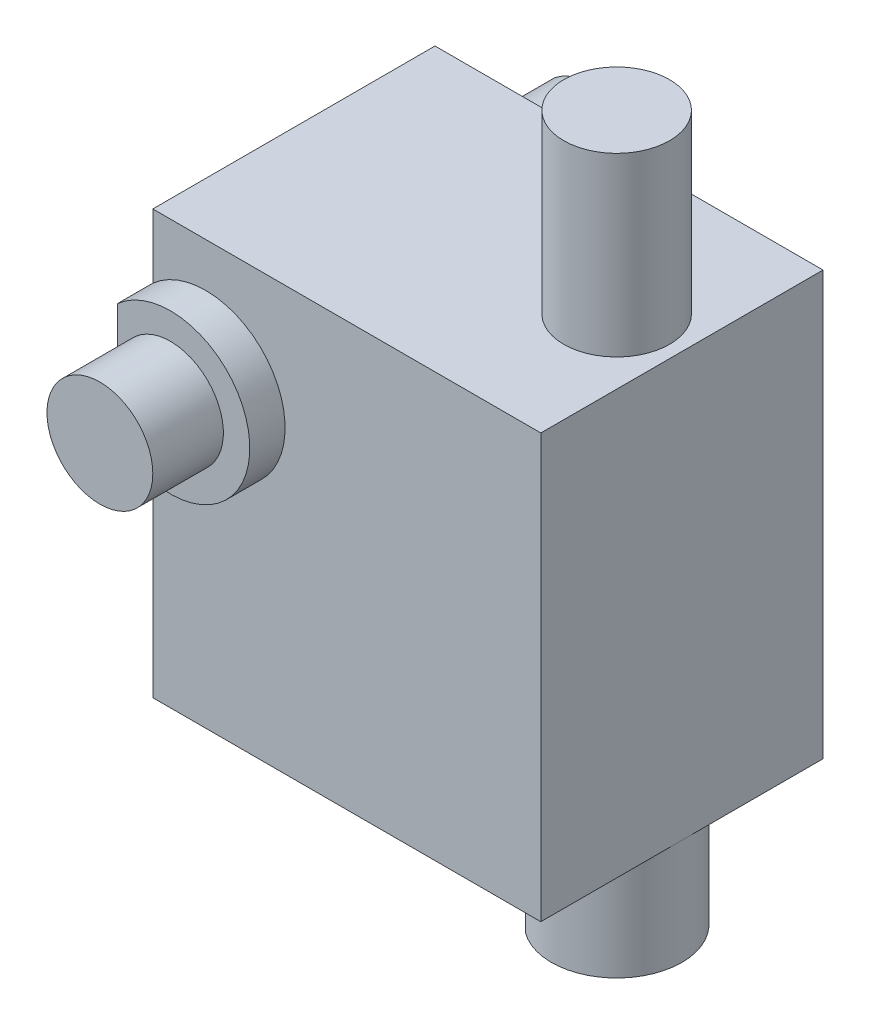
ISO-10303-21;
HEADER;
FILE_DESCRIPTION(('STEP AP214'),'2;1');
FILE_NAME('part.step','',(''),(''),'','','');
FILE_SCHEMA(('AUTOMOTIVE_DESIGN { 1 0 10303 214 1 1 1 1 }'));
ENDSEC;
DATA;
#1=APPLICATION_CONTEXT('core data for automotive mechanical design processes');
#2=APPLICATION_PROTOCOL_DEFINITION('international standard','automotive_design',2000,#1);
#3=PRODUCT_CONTEXT('',#1,'mechanical');
#4=PRODUCT('Part','Part','',(#3));
#5=PRODUCT_RELATED_PRODUCT_CATEGORY('part','',(#4));
#6=PRODUCT_DEFINITION_FORMATION('','',#4);
#7=PRODUCT_DEFINITION_CONTEXT('part definition',#1,'design');
#8=PRODUCT_DEFINITION('design','',#6,#7);
#9=PRODUCT_DEFINITION_SHAPE('','',#8);
#10=(LENGTH_UNIT() NAMED_UNIT(*) SI_UNIT(.MILLI.,.METRE.));
#11=(NAMED_UNIT(*) PLANE_ANGLE_UNIT() SI_UNIT($,.RADIAN.));
#12=(NAMED_UNIT(*) SI_UNIT($,.STERADIAN.) SOLID_ANGLE_UNIT());
#13=UNCERTAINTY_MEASURE_WITH_UNIT(LENGTH_MEASURE(1.E-05),#10,'distance_accuracy_value','');
#14=(GEOMETRIC_REPRESENTATION_CONTEXT(3) GLOBAL_UNCERTAINTY_ASSIGNED_CONTEXT((#13)) GLOBAL_UNIT_ASSIGNED_CONTEXT((#10,
#11,#12)) REPRESENTATION_CONTEXT('',''));
#15=CARTESIAN_POINT('',(0.,0.,0.));
#16=DIRECTION('',(0.,0.,1.));
#17=DIRECTION('',(1.,0.,0.));
#18=AXIS2_PLACEMENT_3D('',#15,#16,#17);
#19=CARTESIAN_POINT('',(-7.65,11.5,-5.));
#20=DIRECTION('',(0.,0.,1.));
#21=DIRECTION('',(1.,0.,0.));
#22=AXIS2_PLACEMENT_3D('',#19,#20,#21);
#23=PLANE('',#22);
#24=CARTESIAN_POINT('',(-7.65,11.5,-5.));
#25=DIRECTION('',(0.,0.,1.));
#26=DIRECTION('',(1.,0.,0.));
#27=AXIS2_PLACEMENT_3D('',#24,#25,#26);
#28=CIRCLE('',#27,2.25);
#29=CARTESIAN_POINT('',(-9.15,9.82294901687516,-5.));
#30=VERTEX_POINT('',#29);
#31=CARTESIAN_POINT('',(-9.15,13.1770509831248,-5.));
#32=VERTEX_POINT('',#31);
#33=EDGE_CURVE('E153',#30,#32,#28,.T.);
#34=ORIENTED_EDGE('',*,*,#33,.F.);
#35=DIRECTION('',(0.,-1.,0.));
#36=VECTOR('',#35,1.);
#37=CARTESIAN_POINT('',(-9.15,13.1770509831248,-5.));
#38=LINE('',#37,#36);
#39=EDGE_CURVE('E159',#32,#30,#38,.T.);
#40=ORIENTED_EDGE('',*,*,#39,.F.);
#41=EDGE_LOOP('',(#34,#40));
#42=FACE_BOUND('',#41,.T.);
#43=CARTESIAN_POINT('',(-7.65,11.5,-5.));
#44=DIRECTION('',(0.,0.,-1.));
#45=DIRECTION('',(-1.,0.,0.));
#46=AXIS2_PLACEMENT_3D('',#43,#44,#45);
#47=CIRCLE('',#46,1.8);
#48=CARTESIAN_POINT('',(-8.75,12.9247806848775,-5.));
#49=VERTEX_POINT('',#48);
#50=CARTESIAN_POINT('',(-8.75,10.0752193151225,-5.));
#51=VERTEX_POINT('',#50);
#52=EDGE_CURVE('E143',#49,#51,#47,.T.);
#53=ORIENTED_EDGE('',*,*,#52,.F.);
#54=DIRECTION('',(0.,1.,0.));
#55=VECTOR('',#54,1.);
#56=CARTESIAN_POINT('',(-8.75,10.0752193151225,-5.));
#57=LINE('',#56,#55);
#58=EDGE_CURVE('E46',#51,#49,#57,.T.);
#59=ORIENTED_EDGE('',*,*,#58,.F.);
#60=EDGE_LOOP('',(#53,#59));
#61=FACE_BOUND('',#60,.T.);
#62=ADVANCED_FACE('F32',(#42,#61),#23,.F.);
#63=CARTESIAN_POINT('',(1.85,15.,4.));
#64=DIRECTION('',(0.,0.,-1.));
#65=DIRECTION('',(-1.,0.,0.));
#66=AXIS2_PLACEMENT_3D('',#63,#64,#65);
#67=PLANE('',#66);
#68=CARTESIAN_POINT('',(-7.65,11.5,4.));
#69=DIRECTION('',(0.,0.,-1.));
#70=DIRECTION('',(-1.,0.,0.));
#71=AXIS2_PLACEMENT_3D('',#68,#69,#70);
#72=CIRCLE('',#71,2.25);
#73=CARTESIAN_POINT('',(-9.15,9.82294901687516,4.));
#74=VERTEX_POINT('',#73);
#75=CARTESIAN_POINT('',(-9.15,13.1770509831248,4.));
#76=VERTEX_POINT('',#75);
#77=EDGE_CURVE('E174',#74,#76,#72,.F.);
#78=ORIENTED_EDGE('',*,*,#77,.F.);
#79=DIRECTION('',(0.,-1.,0.));
#80=VECTOR('',#79,1.);
#81=CARTESIAN_POINT('',(-9.15,15.,4.));
#82=LINE('',#81,#80);
#83=CARTESIAN_POINT('',(-9.15,3.,4.));
#84=VERTEX_POINT('',#83);
#85=EDGE_CURVE('E213',#74,#84,#82,.T.);
#86=ORIENTED_EDGE('',*,*,#85,.T.);
#87=DIRECTION('',(1.,0.,0.));
#88=VECTOR('',#87,1.);
#89=CARTESIAN_POINT('',(1.85,3.,4.));
#90=LINE('',#89,#88);
#91=CARTESIAN_POINT('',(1.85,3.,4.));
#92=VERTEX_POINT('',#91);
#93=EDGE_CURVE('E196',#84,#92,#90,.T.);
#94=ORIENTED_EDGE('',*,*,#93,.T.);
#95=DIRECTION('',(0.,-1.,0.));
#96=VECTOR('',#95,1.);
#97=CARTESIAN_POINT('',(1.85,15.,4.));
#98=LINE('',#97,#96);
#99=CARTESIAN_POINT('',(1.85,15.,4.));
#100=VERTEX_POINT('',#99);
#101=EDGE_CURVE('E210',#100,#92,#98,.T.);
#102=ORIENTED_EDGE('',*,*,#101,.F.);
#103=DIRECTION('',(1.,0.,0.));
#104=VECTOR('',#103,1.);
#105=CARTESIAN_POINT('',(1.85,15.,4.));
#106=LINE('',#105,#104);
#107=CARTESIAN_POINT('',(-9.15,15.,4.));
#108=VERTEX_POINT('',#107);
#109=EDGE_CURVE('E186',#108,#100,#106,.T.);
#110=ORIENTED_EDGE('',*,*,#109,.F.);
#111=EDGE_CURVE('E54',#108,#76,#82,.T.);
#112=ORIENTED_EDGE('',*,*,#111,.T.);
#113=EDGE_LOOP('',(#78,#86,#94,#102,#110,#112));
#114=FACE_BOUND('',#113,.T.);
#115=ADVANCED_FACE('F251',(#114),#67,.F.);
#116=CARTESIAN_POINT('',(1.85,15.,-4.));
#117=DIRECTION('',(0.,0.,1.));
#118=DIRECTION('',(1.,0.,0.));
#119=AXIS2_PLACEMENT_3D('',#116,#117,#118);
#120=PLANE('',#119);
#121=CARTESIAN_POINT('',(-7.65,11.5,-4.));
#122=DIRECTION('',(0.,0.,1.));
#123=DIRECTION('',(1.,0.,0.));
#124=AXIS2_PLACEMENT_3D('',#121,#122,#123);
#125=CIRCLE('',#124,2.25);
#126=CARTESIAN_POINT('',(-9.15,13.1770509831248,-4.));
#127=VERTEX_POINT('',#126);
#128=CARTESIAN_POINT('',(-9.15,9.82294901687516,-4.));
#129=VERTEX_POINT('',#128);
#130=EDGE_CURVE('E11',#127,#129,#125,.F.);
#131=ORIENTED_EDGE('',*,*,#130,.F.);
#132=DIRECTION('',(0.,-1.,0.));
#133=VECTOR('',#132,1.);
#134=CARTESIAN_POINT('',(-9.15,15.,-4.));
#135=LINE('',#134,#133);
#136=CARTESIAN_POINT('',(-9.15,15.,-4.));
#137=VERTEX_POINT('',#136);
#138=EDGE_CURVE('E204',#137,#127,#135,.T.);
#139=ORIENTED_EDGE('',*,*,#138,.F.);
#140=DIRECTION('',(-1.,0.,0.));
#141=VECTOR('',#140,1.);
#142=CARTESIAN_POINT('',(1.85,15.,-4.));
#143=LINE('',#142,#141);
#144=CARTESIAN_POINT('',(1.85,15.,-4.));
#145=VERTEX_POINT('',#144);
#146=EDGE_CURVE('E191',#145,#137,#143,.T.);
#147=ORIENTED_EDGE('',*,*,#146,.F.);
#148=DIRECTION('',(0.,-1.,0.));
#149=VECTOR('',#148,1.);
#150=CARTESIAN_POINT('',(1.85,15.,-4.));
#151=LINE('',#150,#149);
#152=CARTESIAN_POINT('',(1.85,3.,-4.));
#153=VERTEX_POINT('',#152);
#154=EDGE_CURVE('E207',#145,#153,#151,.T.);
#155=ORIENTED_EDGE('',*,*,#154,.T.);
#156=DIRECTION('',(-1.,0.,0.));
#157=VECTOR('',#156,1.);
#158=CARTESIAN_POINT('',(1.85,3.,-4.));
#159=LINE('',#158,#157);
#160=CARTESIAN_POINT('',(-9.15,3.,-4.));
#161=VERTEX_POINT('',#160);
#162=EDGE_CURVE('E187',#153,#161,#159,.T.);
#163=ORIENTED_EDGE('',*,*,#162,.T.);
#164=EDGE_CURVE('E193',#129,#161,#135,.T.);
#165=ORIENTED_EDGE('',*,*,#164,.F.);
#166=EDGE_LOOP('',(#131,#139,#147,#155,#163,#165));
#167=FACE_BOUND('',#166,.T.);
#168=ADVANCED_FACE('F257',(#167),#120,.F.);
#169=CARTESIAN_POINT('',(0.,3.,0.));
#170=DIRECTION('',(0.,-1.,0.));
#171=DIRECTION('',(0.,0.,-1.));
#172=AXIS2_PLACEMENT_3D('',#169,#170,#171);
#173=CYLINDRICAL_SURFACE('',#172,1.85);
#174=CARTESIAN_POINT('',(0.,0.,0.));
#175=DIRECTION('',(0.,1.,0.));
#176=DIRECTION('',(0.,0.,1.));
#177=AXIS2_PLACEMENT_3D('',#174,#175,#176);
#178=CIRCLE('',#177,1.85);
#179=CARTESIAN_POINT('',(-1.1,0.,1.48744747806435));
#180=VERTEX_POINT('',#179);
#181=CARTESIAN_POINT('',(-1.1,0.,-1.48744747806435));
#182=VERTEX_POINT('',#181);
#183=EDGE_CURVE('E215',#180,#182,#178,.T.);
#184=ORIENTED_EDGE('',*,*,#183,.T.);
#185=DIRECTION('',(0.,-1.,0.));
#186=VECTOR('',#185,1.);
#187=CARTESIAN_POINT('',(-1.1,3.,-1.48744747806435));
#188=LINE('',#187,#186);
#189=CARTESIAN_POINT('',(-1.1,3.,-1.48744747806435));
#190=VERTEX_POINT('',#189);
#191=EDGE_CURVE('E40',#190,#182,#188,.T.);
#192=ORIENTED_EDGE('',*,*,#191,.F.);
#193=CARTESIAN_POINT('',(0.,3.,0.));
#194=DIRECTION('',(0.,1.,0.));
#195=DIRECTION('',(0.,0.,1.));
#196=AXIS2_PLACEMENT_3D('',#193,#194,#195);
#197=CIRCLE('',#196,1.85);
#198=CARTESIAN_POINT('',(1.85,3.,0.));
#199=VERTEX_POINT('',#198);
#200=EDGE_CURVE('E220',#199,#190,#197,.T.);
#201=ORIENTED_EDGE('',*,*,#200,.F.);
#202=CARTESIAN_POINT('',(-1.1,3.,1.48744747806435));
#203=VERTEX_POINT('',#202);
#204=EDGE_CURVE('E216',#203,#199,#197,.T.);
#205=ORIENTED_EDGE('',*,*,#204,.F.);
#206=DIRECTION('',(0.,-1.,0.));
#207=VECTOR('',#206,1.);
#208=CARTESIAN_POINT('',(-1.1,3.,1.48744747806435));
#209=LINE('',#208,#207);
#210=EDGE_CURVE('E223',#203,#180,#209,.T.);
#211=ORIENTED_EDGE('',*,*,#210,.T.);
#212=EDGE_LOOP('',(#184,#192,#201,#205,#211));
#213=FACE_BOUND('',#212,.T.);
#214=ADVANCED_FACE('F34',(#213),#173,.T.);
#215=CARTESIAN_POINT('',(-1.1,3.,-1.48744747806435));
#216=DIRECTION('',(1.,0.,0.));
#217=DIRECTION('',(0.,0.,-1.));
#218=AXIS2_PLACEMENT_3D('',#215,#216,#217);
#219=PLANE('',#218);
#220=DIRECTION('',(0.,0.,1.));
#221=VECTOR('',#220,1.);
#222=CARTESIAN_POINT('',(-1.1,0.,-1.48744747806435));
#223=LINE('',#222,#221);
#224=EDGE_CURVE('E226',#182,#180,#223,.T.);
#225=ORIENTED_EDGE('',*,*,#224,.T.);
#226=ORIENTED_EDGE('',*,*,#210,.F.);
#227=DIRECTION('',(0.,0.,1.));
#228=VECTOR('',#227,1.);
#229=CARTESIAN_POINT('',(-1.1,3.,-1.48744747806435));
#230=LINE('',#229,#228);
#231=EDGE_CURVE('E219',#190,#203,#230,.T.);
#232=ORIENTED_EDGE('',*,*,#231,.F.);
#233=ORIENTED_EDGE('',*,*,#191,.T.);
#234=EDGE_LOOP('',(#225,#226,#232,#233));
#235=FACE_BOUND('',#234,.T.);
#236=ADVANCED_FACE('F232',(#235),#219,.F.);
#237=CARTESIAN_POINT('',(0.,0.,0.));
#238=DIRECTION('',(0.,1.,0.));
#239=DIRECTION('',(0.,0.,1.));
#240=AXIS2_PLACEMENT_3D('',#237,#238,#239);
#241=PLANE('',#240);
#242=ORIENTED_EDGE('',*,*,#183,.F.);
#243=ORIENTED_EDGE('',*,*,#224,.F.);
#244=EDGE_LOOP('',(#242,#243));
#245=FACE_BOUND('',#244,.T.);
#246=ADVANCED_FACE('F238',(#245),#241,.F.);
#247=CARTESIAN_POINT('',(0.,3.,0.));
#248=DIRECTION('',(0.,1.,0.));
#249=DIRECTION('',(0.,0.,1.));
#250=AXIS2_PLACEMENT_3D('',#247,#248,#249);
#251=PLANE('',#250);
#252=ORIENTED_EDGE('',*,*,#231,.T.);
#253=ORIENTED_EDGE('',*,*,#204,.T.);
#254=DIRECTION('',(0.,0.,-1.));
#255=VECTOR('',#254,1.);
#256=CARTESIAN_POINT('',(1.85,3.,4.));
#257=LINE('',#256,#255);
#258=EDGE_CURVE('E199',#92,#199,#257,.T.);
#259=ORIENTED_EDGE('',*,*,#258,.F.);
#260=ORIENTED_EDGE('',*,*,#93,.F.);
#261=DIRECTION('',(0.,0.,1.));
#262=VECTOR('',#261,1.);
#263=CARTESIAN_POINT('',(-9.15,3.,4.));
#264=LINE('',#263,#262);
#265=EDGE_CURVE('E180',#161,#84,#264,.T.);
#266=ORIENTED_EDGE('',*,*,#265,.F.);
#267=ORIENTED_EDGE('',*,*,#162,.F.);
#268=EDGE_CURVE('E198',#199,#153,#257,.T.);
#269=ORIENTED_EDGE('',*,*,#268,.F.);
#270=ORIENTED_EDGE('',*,*,#200,.T.);
#271=EDGE_LOOP('',(#252,#253,#259,#260,#266,#267,#269,#270));
#272=FACE_BOUND('',#271,.T.);
#273=ADVANCED_FACE('F240',(#272),#251,.F.);
#274=CARTESIAN_POINT('',(-9.15,15.,4.));
#275=DIRECTION('',(1.,0.,0.));
#276=DIRECTION('',(0.,0.,-1.));
#277=AXIS2_PLACEMENT_3D('',#274,#275,#276);
#278=PLANE('',#277);
#279=DIRECTION('',(0.,0.,-1.));
#280=VECTOR('',#279,1.);
#281=CARTESIAN_POINT('',(-9.15,13.1770509831248,5.));
#282=LINE('',#281,#280);
#283=CARTESIAN_POINT('',(-9.15,13.1770509831248,5.));
#284=VERTEX_POINT('',#283);
#285=EDGE_CURVE('E171',#284,#76,#282,.T.);
#286=ORIENTED_EDGE('',*,*,#285,.T.);
#287=ORIENTED_EDGE('',*,*,#111,.F.);
#288=DIRECTION('',(0.,0.,1.));
#289=VECTOR('',#288,1.);
#290=CARTESIAN_POINT('',(-9.15,15.,4.));
#291=LINE('',#290,#289);
#292=EDGE_CURVE('E183',#137,#108,#291,.T.);
#293=ORIENTED_EDGE('',*,*,#292,.F.);
#294=ORIENTED_EDGE('',*,*,#138,.T.);
#295=EDGE_CURVE('E170',#127,#32,#282,.T.);
#296=ORIENTED_EDGE('',*,*,#295,.T.);
#297=ORIENTED_EDGE('',*,*,#39,.T.);
#298=DIRECTION('',(0.,0.,-1.));
#299=VECTOR('',#298,1.);
#300=CARTESIAN_POINT('',(-9.15,9.82294901687516,5.));
#301=LINE('',#300,#299);
#302=EDGE_CURVE('E162',#129,#30,#301,.T.);
#303=ORIENTED_EDGE('',*,*,#302,.F.);
#304=ORIENTED_EDGE('',*,*,#164,.T.);
#305=ORIENTED_EDGE('',*,*,#265,.T.);
#306=ORIENTED_EDGE('',*,*,#85,.F.);
#307=CARTESIAN_POINT('',(-9.15,9.82294901687516,5.));
#308=VERTEX_POINT('',#307);
#309=EDGE_CURVE('E167',#308,#74,#301,.T.);
#310=ORIENTED_EDGE('',*,*,#309,.F.);
#311=DIRECTION('',(0.,-1.,0.));
#312=VECTOR('',#311,1.);
#313=CARTESIAN_POINT('',(-9.15,13.1770509831248,5.));
#314=LINE('',#313,#312);
#315=CARTESIAN_POINT('',(-9.15,11.5,5.));
#316=VERTEX_POINT('',#315);
#317=EDGE_CURVE('E158',#316,#308,#314,.T.);
#318=ORIENTED_EDGE('',*,*,#317,.F.);
#319=EDGE_CURVE('E160',#284,#316,#314,.T.);
#320=ORIENTED_EDGE('',*,*,#319,.F.);
#321=EDGE_LOOP('',(#286,#287,#293,#294,#296,#297,#303,#304,#305,#306,#310,#318,#320));
#322=FACE_BOUND('',#321,.T.);
#323=ADVANCED_FACE('F246',(#322),#278,.F.);
#324=CARTESIAN_POINT('',(1.85,15.,4.));
#325=DIRECTION('',(-1.,0.,0.));
#326=DIRECTION('',(0.,0.,1.));
#327=AXIS2_PLACEMENT_3D('',#324,#325,#326);
#328=PLANE('',#327);
#329=ORIENTED_EDGE('',*,*,#258,.T.);
#330=ORIENTED_EDGE('',*,*,#268,.T.);
#331=ORIENTED_EDGE('',*,*,#154,.F.);
#332=DIRECTION('',(0.,0.,-1.));
#333=VECTOR('',#332,1.);
#334=CARTESIAN_POINT('',(1.85,15.,4.));
#335=LINE('',#334,#333);
#336=EDGE_CURVE('E189',#100,#145,#335,.T.);
#337=ORIENTED_EDGE('',*,*,#336,.F.);
#338=ORIENTED_EDGE('',*,*,#101,.T.);
#339=EDGE_LOOP('',(#329,#330,#331,#337,#338));
#340=FACE_BOUND('',#339,.T.);
#341=ADVANCED_FACE('F279',(#340),#328,.F.);
#342=CARTESIAN_POINT('',(0.,15.,0.));
#343=DIRECTION('',(0.,1.,0.));
#344=DIRECTION('',(0.,0.,1.));
#345=AXIS2_PLACEMENT_3D('',#342,#343,#344);
#346=PLANE('',#345);
#347=CARTESIAN_POINT('',(0.,15.,0.));
#348=DIRECTION('',(0.,1.,0.));
#349=DIRECTION('',(0.,0.,1.));
#350=AXIS2_PLACEMENT_3D('',#347,#348,#349);
#351=CIRCLE('',#350,1.5);
#352=CARTESIAN_POINT('',(0.,15.,1.5));
#353=VERTEX_POINT('',#352);
#354=EDGE_CURVE('E176',#353,#353,#351,.T.);
#355=ORIENTED_EDGE('',*,*,#354,.F.);
#356=EDGE_LOOP('',(#355));
#357=FACE_BOUND('',#356,.T.);
#358=ORIENTED_EDGE('',*,*,#292,.T.);
#359=ORIENTED_EDGE('',*,*,#109,.T.);
#360=ORIENTED_EDGE('',*,*,#336,.T.);
#361=ORIENTED_EDGE('',*,*,#146,.T.);
#362=EDGE_LOOP('',(#358,#359,#360,#361));
#363=FACE_BOUND('',#362,.T.);
#364=ADVANCED_FACE('F276',(#357,#363),#346,.T.);
#365=CARTESIAN_POINT('',(0.,20.,0.));
#366=DIRECTION('',(0.,-1.,0.));
#367=DIRECTION('',(0.,0.,-1.));
#368=AXIS2_PLACEMENT_3D('',#365,#366,#367);
#369=CYLINDRICAL_SURFACE('',#368,1.5);
#370=CARTESIAN_POINT('',(0.,20.,0.));
#371=DIRECTION('',(0.,1.,0.));
#372=DIRECTION('',(0.,0.,1.));
#373=AXIS2_PLACEMENT_3D('',#370,#371,#372);
#374=CIRCLE('',#373,1.5);
#375=CARTESIAN_POINT('',(0.,20.,1.5));
#376=VERTEX_POINT('',#375);
#377=EDGE_CURVE('E177',#376,#376,#374,.T.);
#378=ORIENTED_EDGE('',*,*,#377,.F.);
#379=EDGE_LOOP('',(#378));
#380=FACE_BOUND('',#379,.T.);
#381=ORIENTED_EDGE('',*,*,#354,.T.);
#382=EDGE_LOOP('',(#381));
#383=FACE_BOUND('',#382,.T.);
#384=ADVANCED_FACE('F272',(#380,#383),#369,.T.);
#385=CARTESIAN_POINT('',(0.,20.,0.));
#386=DIRECTION('',(0.,1.,0.));
#387=DIRECTION('',(0.,0.,1.));
#388=AXIS2_PLACEMENT_3D('',#385,#386,#387);
#389=PLANE('',#388);
#390=ORIENTED_EDGE('',*,*,#377,.T.);
#391=EDGE_LOOP('',(#390));
#392=FACE_BOUND('',#391,.T.);
#393=ADVANCED_FACE('F269',(#392),#389,.T.);
#394=CARTESIAN_POINT('',(-7.65,11.5,5.));
#395=DIRECTION('',(0.,0.,-1.));
#396=DIRECTION('',(-1.,0.,0.));
#397=AXIS2_PLACEMENT_3D('',#394,#395,#396);
#398=CYLINDRICAL_SURFACE('',#397,2.25);
#399=ORIENTED_EDGE('',*,*,#295,.F.);
#400=ORIENTED_EDGE('',*,*,#130,.T.);
#401=ORIENTED_EDGE('',*,*,#302,.T.);
#402=ORIENTED_EDGE('',*,*,#33,.T.);
#403=EDGE_LOOP('',(#399,#400,#401,#402));
#404=FACE_BOUND('',#403,.T.);
#405=ADVANCED_FACE('F267',(#404),#398,.T.);
#406=ORIENTED_EDGE('',*,*,#309,.T.);
#407=ORIENTED_EDGE('',*,*,#77,.T.);
#408=ORIENTED_EDGE('',*,*,#285,.F.);
#409=CARTESIAN_POINT('',(-7.65,11.5,5.));
#410=DIRECTION('',(0.,0.,1.));
#411=DIRECTION('',(1.,0.,0.));
#412=AXIS2_PLACEMENT_3D('',#409,#410,#411);
#413=CIRCLE('',#412,2.25);
#414=EDGE_CURVE('E155',#308,#284,#413,.T.);
#415=ORIENTED_EDGE('',*,*,#414,.F.);
#416=EDGE_LOOP('',(#406,#407,#408,#415));
#417=FACE_BOUND('',#416,.T.);
#418=ADVANCED_FACE('F264',(#417),#398,.T.);
#419=CARTESIAN_POINT('',(-7.65,11.5,5.));
#420=DIRECTION('',(0.,0.,1.));
#421=DIRECTION('',(1.,0.,0.));
#422=AXIS2_PLACEMENT_3D('',#419,#420,#421);
#423=PLANE('',#422);
#424=ORIENTED_EDGE('',*,*,#319,.T.);
#425=CARTESIAN_POINT('',(-7.65,11.5,5.));
#426=DIRECTION('',(0.,0.,1.));
#427=DIRECTION('',(1.,0.,0.));
#428=AXIS2_PLACEMENT_3D('',#425,#426,#427);
#429=CIRCLE('',#428,1.5);
#430=EDGE_CURVE('E144',#316,#316,#429,.T.);
#431=ORIENTED_EDGE('',*,*,#430,.F.);
#432=ORIENTED_EDGE('',*,*,#317,.T.);
#433=ORIENTED_EDGE('',*,*,#414,.T.);
#434=EDGE_LOOP('',(#424,#431,#432,#433));
#435=FACE_BOUND('',#434,.T.);
#436=ADVANCED_FACE('F262',(#435),#423,.T.);
#437=CARTESIAN_POINT('',(-7.65,11.5,7.));
#438=DIRECTION('',(0.,0.,-1.));
#439=DIRECTION('',(-1.,0.,0.));
#440=AXIS2_PLACEMENT_3D('',#437,#438,#439);
#441=CYLINDRICAL_SURFACE('',#440,1.5);
#442=CARTESIAN_POINT('',(-7.65,11.5,7.));
#443=DIRECTION('',(0.,0.,1.));
#444=DIRECTION('',(1.,0.,0.));
#445=AXIS2_PLACEMENT_3D('',#442,#443,#444);
#446=CIRCLE('',#445,1.5);
#447=CARTESIAN_POINT('',(-6.15,11.5,7.));
#448=VERTEX_POINT('',#447);
#449=EDGE_CURVE('E147',#448,#448,#446,.T.);
#450=ORIENTED_EDGE('',*,*,#449,.F.);
#451=EDGE_LOOP('',(#450));
#452=FACE_BOUND('',#451,.T.);
#453=ORIENTED_EDGE('',*,*,#430,.T.);
#454=EDGE_LOOP('',(#453));
#455=FACE_BOUND('',#454,.T.);
#456=ADVANCED_FACE('F327',(#452,#455),#441,.T.);
#457=CARTESIAN_POINT('',(-7.65,11.5,7.));
#458=DIRECTION('',(0.,0.,1.));
#459=DIRECTION('',(1.,0.,0.));
#460=AXIS2_PLACEMENT_3D('',#457,#458,#459);
#461=PLANE('',#460);
#462=ORIENTED_EDGE('',*,*,#449,.T.);
#463=EDGE_LOOP('',(#462));
#464=FACE_BOUND('',#463,.T.);
#465=ADVANCED_FACE('F334',(#464),#461,.T.);
#466=CARTESIAN_POINT('',(-7.65,11.5,-7.));
#467=DIRECTION('',(0.,0.,1.));
#468=DIRECTION('',(1.,0.,0.));
#469=AXIS2_PLACEMENT_3D('',#466,#467,#468);
#470=CYLINDRICAL_SURFACE('',#469,1.8);
#471=ORIENTED_EDGE('',*,*,#52,.T.);
#472=DIRECTION('',(0.,0.,1.));
#473=VECTOR('',#472,1.);
#474=CARTESIAN_POINT('',(-8.75,10.0752193151225,-7.));
#475=LINE('',#474,#473);
#476=CARTESIAN_POINT('',(-8.75,10.0752193151225,-7.));
#477=VERTEX_POINT('',#476);
#478=EDGE_CURVE('E131',#477,#51,#475,.T.);
#479=ORIENTED_EDGE('',*,*,#478,.F.);
#480=CARTESIAN_POINT('',(-7.65,11.5,-7.));
#481=DIRECTION('',(0.,0.,-1.));
#482=DIRECTION('',(-1.,0.,0.));
#483=AXIS2_PLACEMENT_3D('',#480,#481,#482);
#484=CIRCLE('',#483,1.8);
#485=CARTESIAN_POINT('',(-8.75,12.9247806848775,-7.));
#486=VERTEX_POINT('',#485);
#487=EDGE_CURVE('E137',#486,#477,#484,.T.);
#488=ORIENTED_EDGE('',*,*,#487,.F.);
#489=DIRECTION('',(0.,0.,1.));
#490=VECTOR('',#489,1.);
#491=CARTESIAN_POINT('',(-8.75,12.9247806848775,-7.));
#492=LINE('',#491,#490);
#493=EDGE_CURVE('E134',#486,#49,#492,.T.);
#494=ORIENTED_EDGE('',*,*,#493,.T.);
#495=EDGE_LOOP('',(#471,#479,#488,#494));
#496=FACE_BOUND('',#495,.T.);
#497=ADVANCED_FACE('F142',(#496),#470,.T.);
#498=CARTESIAN_POINT('',(-8.75,10.0752193151225,-7.));
#499=DIRECTION('',(1.,0.,0.));
#500=DIRECTION('',(0.,0.,-1.));
#501=AXIS2_PLACEMENT_3D('',#498,#499,#500);
#502=PLANE('',#501);
#503=ORIENTED_EDGE('',*,*,#58,.T.);
#504=ORIENTED_EDGE('',*,*,#493,.F.);
#505=DIRECTION('',(0.,1.,0.));
#506=VECTOR('',#505,1.);
#507=CARTESIAN_POINT('',(-8.75,10.0752193151225,-7.));
#508=LINE('',#507,#506);
#509=EDGE_CURVE('E127',#477,#486,#508,.T.);
#510=ORIENTED_EDGE('',*,*,#509,.F.);
#511=ORIENTED_EDGE('',*,*,#478,.T.);
#512=EDGE_LOOP('',(#503,#504,#510,#511));
#513=FACE_BOUND('',#512,.T.);
#514=ADVANCED_FACE('F129',(#513),#502,.F.);
#515=CARTESIAN_POINT('',(-7.65,11.5,-7.));
#516=DIRECTION('',(0.,0.,-1.));
#517=DIRECTION('',(-1.,0.,0.));
#518=AXIS2_PLACEMENT_3D('',#515,#516,#517);
#519=PLANE('',#518);
#520=ORIENTED_EDGE('',*,*,#487,.T.);
#521=ORIENTED_EDGE('',*,*,#509,.T.);
#522=EDGE_LOOP('',(#520,#521));
#523=FACE_BOUND('',#522,.T.);
#524=ADVANCED_FACE('F139',(#523),#519,.T.);
#525=CLOSED_SHELL('',(#62,#115,#168,#214,#236,#246,#273,#323,#341,#364,#384,#393,#405,#418,#436,
#456,#465,#497,#514,#524));
#526=MANIFOLD_SOLID_BREP('B2',#525);
#527=ADVANCED_BREP_SHAPE_REPRESENTATION('',(#18,#526),#14);
#528=SHAPE_DEFINITION_REPRESENTATION(#9,#527);
ENDSEC;
END-ISO-10303-21;
